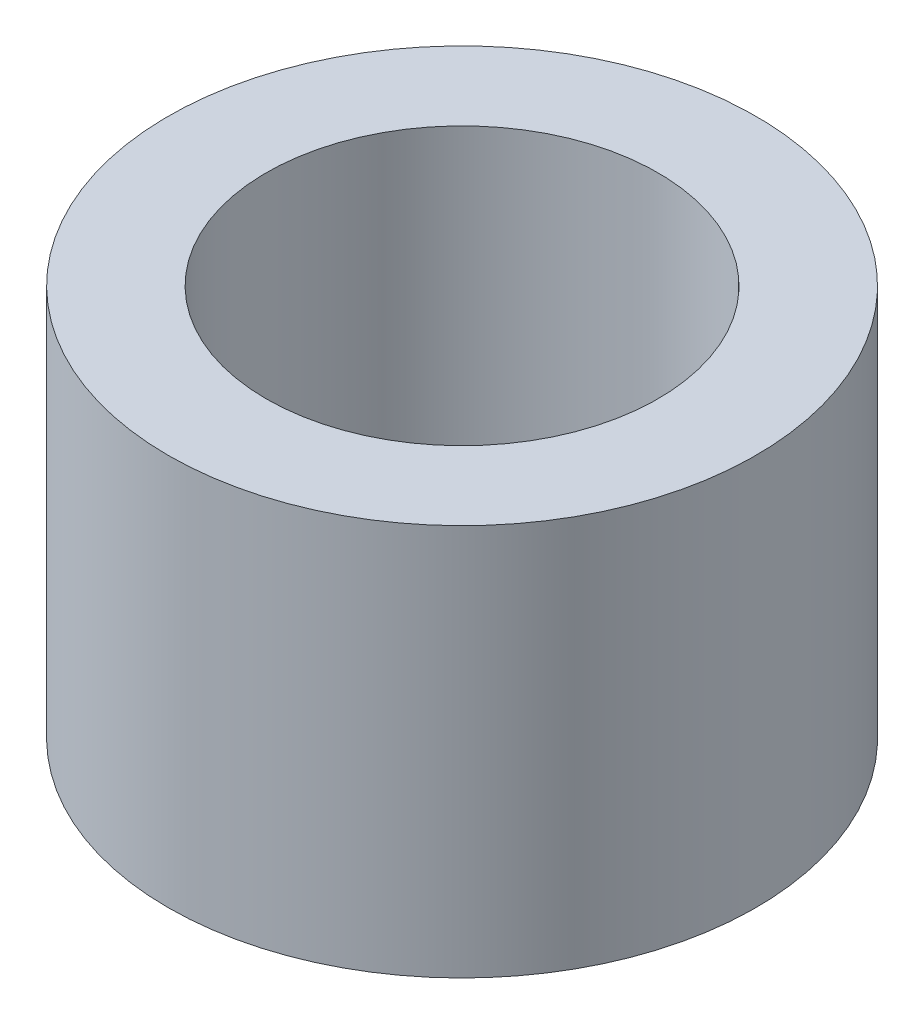
ISO-10303-21;
HEADER;
FILE_DESCRIPTION(('STEP AP214'),'2;1');
FILE_NAME('part.step','',(''),(''),'','','');
FILE_SCHEMA(('AUTOMOTIVE_DESIGN { 1 0 10303 214 1 1 1 1 }'));
ENDSEC;
DATA;
#1=APPLICATION_CONTEXT('core data for automotive mechanical design processes');
#2=APPLICATION_PROTOCOL_DEFINITION('international standard','automotive_design',2000,#1);
#3=PRODUCT_CONTEXT('',#1,'mechanical');
#4=PRODUCT('Part','Part','',(#3));
#5=PRODUCT_RELATED_PRODUCT_CATEGORY('part','',(#4));
#6=PRODUCT_DEFINITION_FORMATION('','',#4);
#7=PRODUCT_DEFINITION_CONTEXT('part definition',#1,'design');
#8=PRODUCT_DEFINITION('design','',#6,#7);
#9=PRODUCT_DEFINITION_SHAPE('','',#8);
#10=(LENGTH_UNIT() NAMED_UNIT(*) SI_UNIT(.MILLI.,.METRE.));
#11=(NAMED_UNIT(*) PLANE_ANGLE_UNIT() SI_UNIT($,.RADIAN.));
#12=(NAMED_UNIT(*) SI_UNIT($,.STERADIAN.) SOLID_ANGLE_UNIT());
#13=UNCERTAINTY_MEASURE_WITH_UNIT(LENGTH_MEASURE(1.E-05),#10,'distance_accuracy_value','');
#14=(GEOMETRIC_REPRESENTATION_CONTEXT(3) GLOBAL_UNCERTAINTY_ASSIGNED_CONTEXT((#13)) GLOBAL_UNIT_ASSIGNED_CONTEXT((#10,
#11,#12)) REPRESENTATION_CONTEXT('',''));
#15=CARTESIAN_POINT('',(0.,0.,0.));
#16=DIRECTION('',(0.,0.,1.));
#17=DIRECTION('',(1.,0.,0.));
#18=AXIS2_PLACEMENT_3D('',#15,#16,#17);
#19=CARTESIAN_POINT('',(0.,6.35,0.));
#20=DIRECTION('',(0.,-1.,0.));
#21=DIRECTION('',(0.,0.,-1.));
#22=AXIS2_PLACEMENT_3D('',#19,#20,#21);
#23=CYLINDRICAL_SURFACE('',#22,4.7625);
#24=CARTESIAN_POINT('',(0.,6.35,0.));
#25=DIRECTION('',(0.,1.,0.));
#26=DIRECTION('',(0.,0.,1.));
#27=AXIS2_PLACEMENT_3D('',#24,#25,#26);
#28=CIRCLE('',#27,4.7625);
#29=CARTESIAN_POINT('',(0.,6.35,4.7625));
#30=VERTEX_POINT('',#29);
#31=EDGE_CURVE('E10',#30,#30,#28,.T.);
#32=ORIENTED_EDGE('',*,*,#31,.F.);
#33=EDGE_LOOP('',(#32));
#34=FACE_BOUND('',#33,.T.);
#35=CARTESIAN_POINT('',(0.,0.,0.));
#36=DIRECTION('',(0.,1.,0.));
#37=DIRECTION('',(0.,0.,1.));
#38=AXIS2_PLACEMENT_3D('',#35,#36,#37);
#39=CIRCLE('',#38,4.7625);
#40=CARTESIAN_POINT('',(0.,0.,4.7625));
#41=VERTEX_POINT('',#40);
#42=EDGE_CURVE('E37',#41,#41,#39,.T.);
#43=ORIENTED_EDGE('',*,*,#42,.T.);
#44=EDGE_LOOP('',(#43));
#45=FACE_BOUND('',#44,.T.);
#46=ADVANCED_FACE('F40',(#34,#45),#23,.T.);
#47=CARTESIAN_POINT('',(0.,6.35,0.));
#48=DIRECTION('',(0.,1.,0.));
#49=DIRECTION('',(0.,0.,1.));
#50=AXIS2_PLACEMENT_3D('',#47,#48,#49);
#51=PLANE('',#50);
#52=CARTESIAN_POINT('',(0.,6.35,0.));
#53=DIRECTION('',(0.,1.,0.));
#54=DIRECTION('',(0.,0.,1.));
#55=AXIS2_PLACEMENT_3D('',#52,#53,#54);
#56=CIRCLE('',#55,3.175);
#57=CARTESIAN_POINT('',(0.,6.35,3.175));
#58=VERTEX_POINT('',#57);
#59=EDGE_CURVE('E47',#58,#58,#56,.T.);
#60=ORIENTED_EDGE('',*,*,#59,.F.);
#61=EDGE_LOOP('',(#60));
#62=FACE_BOUND('',#61,.T.);
#63=ORIENTED_EDGE('',*,*,#31,.T.);
#64=EDGE_LOOP('',(#63));
#65=FACE_BOUND('',#64,.T.);
#66=ADVANCED_FACE('F62',(#62,#65),#51,.T.);
#67=CARTESIAN_POINT('',(0.,0.,0.));
#68=DIRECTION('',(0.,1.,0.));
#69=DIRECTION('',(0.,0.,1.));
#70=AXIS2_PLACEMENT_3D('',#67,#68,#69);
#71=PLANE('',#70);
#72=CARTESIAN_POINT('',(0.,0.,0.));
#73=DIRECTION('',(0.,1.,0.));
#74=DIRECTION('',(0.,0.,1.));
#75=AXIS2_PLACEMENT_3D('',#72,#73,#74);
#76=CIRCLE('',#75,3.175);
#77=CARTESIAN_POINT('',(0.,0.,3.175));
#78=VERTEX_POINT('',#77);
#79=EDGE_CURVE('E50',#78,#78,#76,.T.);
#80=ORIENTED_EDGE('',*,*,#79,.T.);
#81=EDGE_LOOP('',(#80));
#82=FACE_BOUND('',#81,.T.);
#83=ORIENTED_EDGE('',*,*,#42,.F.);
#84=EDGE_LOOP('',(#83));
#85=FACE_BOUND('',#84,.T.);
#86=ADVANCED_FACE('F54',(#82,#85),#71,.F.);
#87=CARTESIAN_POINT('',(0.,0.,0.));
#88=DIRECTION('',(0.,1.,0.));
#89=DIRECTION('',(0.,0.,1.));
#90=AXIS2_PLACEMENT_3D('',#87,#88,#89);
#91=CYLINDRICAL_SURFACE('',#90,3.175);
#92=ORIENTED_EDGE('',*,*,#79,.F.);
#93=EDGE_LOOP('',(#92));
#94=FACE_BOUND('',#93,.T.);
#95=ORIENTED_EDGE('',*,*,#59,.T.);
#96=EDGE_LOOP('',(#95));
#97=FACE_BOUND('',#96,.T.);
#98=ADVANCED_FACE('F59',(#94,#97),#91,.F.);
#99=CLOSED_SHELL('',(#46,#66,#86,#98));
#100=MANIFOLD_SOLID_BREP('B2',#99);
#101=ADVANCED_BREP_SHAPE_REPRESENTATION('',(#18,#100),#14);
#102=SHAPE_DEFINITION_REPRESENTATION(#9,#101);
ENDSEC;
END-ISO-10303-21;
